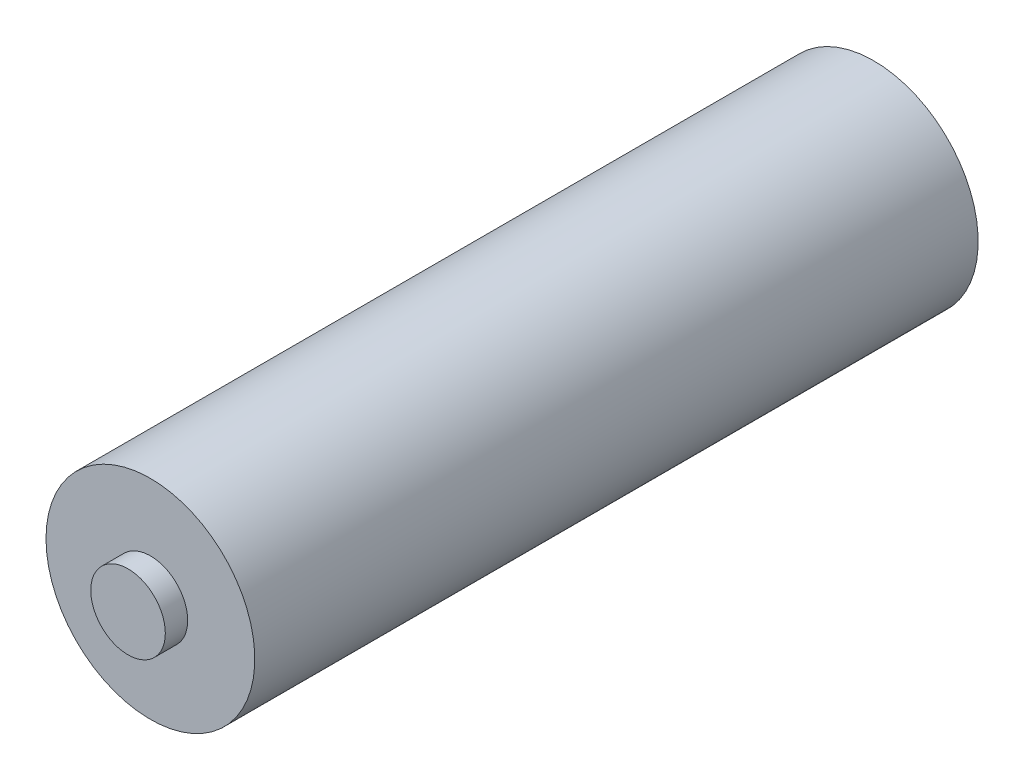
ISO-10303-21;
HEADER;
FILE_DESCRIPTION(('STEP AP214'),'2;1');
FILE_NAME('part.step','',(''),(''),'','','');
FILE_SCHEMA(('AUTOMOTIVE_DESIGN { 1 0 10303 214 1 1 1 1 }'));
ENDSEC;
DATA;
#1=APPLICATION_CONTEXT('core data for automotive mechanical design processes');
#2=APPLICATION_PROTOCOL_DEFINITION('international standard','automotive_design',2000,#1);
#3=PRODUCT_CONTEXT('',#1,'mechanical');
#4=PRODUCT('Part','Part','',(#3));
#5=PRODUCT_RELATED_PRODUCT_CATEGORY('part','',(#4));
#6=PRODUCT_DEFINITION_FORMATION('','',#4);
#7=PRODUCT_DEFINITION_CONTEXT('part definition',#1,'design');
#8=PRODUCT_DEFINITION('design','',#6,#7);
#9=PRODUCT_DEFINITION_SHAPE('','',#8);
#10=(LENGTH_UNIT() NAMED_UNIT(*) SI_UNIT(.MILLI.,.METRE.));
#11=(NAMED_UNIT(*) PLANE_ANGLE_UNIT() SI_UNIT($,.RADIAN.));
#12=(NAMED_UNIT(*) SI_UNIT($,.STERADIAN.) SOLID_ANGLE_UNIT());
#13=UNCERTAINTY_MEASURE_WITH_UNIT(LENGTH_MEASURE(1.E-05),#10,'distance_accuracy_value','');
#14=(GEOMETRIC_REPRESENTATION_CONTEXT(3) GLOBAL_UNCERTAINTY_ASSIGNED_CONTEXT((#13)) GLOBAL_UNIT_ASSIGNED_CONTEXT((#10,
#11,#12)) REPRESENTATION_CONTEXT('',''));
#15=CARTESIAN_POINT('',(0.,0.,0.));
#16=DIRECTION('',(0.,0.,1.));
#17=DIRECTION('',(1.,0.,0.));
#18=AXIS2_PLACEMENT_3D('',#15,#16,#17);
#19=CARTESIAN_POINT('',(0.,0.,48.5));
#20=DIRECTION('',(0.,0.,-1.));
#21=DIRECTION('',(-1.,0.,0.));
#22=AXIS2_PLACEMENT_3D('',#19,#20,#21);
#23=CYLINDRICAL_SURFACE('',#22,7.);
#24=CARTESIAN_POINT('',(0.,0.,48.5));
#25=DIRECTION('',(0.,0.,1.));
#26=DIRECTION('',(1.,0.,0.));
#27=AXIS2_PLACEMENT_3D('',#24,#25,#26);
#28=CIRCLE('',#27,7.);
#29=CARTESIAN_POINT('',(-7.,0.,48.5));
#30=VERTEX_POINT('',#29);
#31=EDGE_CURVE('E45',#30,#30,#28,.T.);
#32=CARTESIAN_POINT('',(0.,0.,0.));
#33=DIRECTION('',(0.,0.,1.));
#34=DIRECTION('',(1.,0.,0.));
#35=AXIS2_PLACEMENT_3D('',#32,#33,#34);
#36=CIRCLE('',#35,7.);
#37=CARTESIAN_POINT('',(-7.,0.,0.));
#38=VERTEX_POINT('',#37);
#39=EDGE_CURVE('E40',#38,#38,#36,.T.);
#40=CARTESIAN_POINT('',(-7.,0.,48.5));
#41=CARTESIAN_POINT('',(-7.,0.,47.9947916666667));
#42=CARTESIAN_POINT('',(-7.,0.,47.4895833333333));
#43=CARTESIAN_POINT('',(-7.,0.,46.4791666666667));
#44=CARTESIAN_POINT('',(-7.,0.,45.9739583333333));
#45=CARTESIAN_POINT('',(-7.,0.,44.9635416666667));
#46=CARTESIAN_POINT('',(-7.,0.,44.4583333333333));
#47=CARTESIAN_POINT('',(-7.,0.,43.4479166666667));
#48=CARTESIAN_POINT('',(-7.,0.,42.9427083333333));
#49=CARTESIAN_POINT('',(-7.,0.,41.9322916666667));
#50=CARTESIAN_POINT('',(-7.,0.,41.4270833333333));
#51=CARTESIAN_POINT('',(-7.,0.,40.4166666666667));
#52=CARTESIAN_POINT('',(-7.,0.,39.9114583333333));
#53=CARTESIAN_POINT('',(-7.,0.,38.9010416666667));
#54=CARTESIAN_POINT('',(-7.,0.,38.3958333333333));
#55=CARTESIAN_POINT('',(-7.,0.,37.3854166666667));
#56=CARTESIAN_POINT('',(-7.,0.,36.8802083333333));
#57=CARTESIAN_POINT('',(-7.,0.,35.8697916666667));
#58=CARTESIAN_POINT('',(-7.,0.,35.3645833333333));
#59=CARTESIAN_POINT('',(-7.,0.,34.3541666666667));
#60=CARTESIAN_POINT('',(-7.,0.,33.8489583333333));
#61=CARTESIAN_POINT('',(-7.,0.,32.8385416666667));
#62=CARTESIAN_POINT('',(-7.,0.,32.3333333333333));
#63=CARTESIAN_POINT('',(-7.,0.,31.3229166666667));
#64=CARTESIAN_POINT('',(-7.,0.,30.8177083333333));
#65=CARTESIAN_POINT('',(-7.,0.,29.8072916666667));
#66=CARTESIAN_POINT('',(-7.,0.,29.3020833333333));
#67=CARTESIAN_POINT('',(-7.,0.,28.2916666666667));
#68=CARTESIAN_POINT('',(-7.,0.,27.7864583333333));
#69=CARTESIAN_POINT('',(-7.,0.,26.7760416666667));
#70=CARTESIAN_POINT('',(-7.,0.,26.2708333333333));
#71=CARTESIAN_POINT('',(-7.,0.,25.2604166666667));
#72=CARTESIAN_POINT('',(-7.,0.,24.7552083333333));
#73=CARTESIAN_POINT('',(-7.,0.,23.7447916666667));
#74=CARTESIAN_POINT('',(-7.,0.,23.2395833333333));
#75=CARTESIAN_POINT('',(-7.,0.,22.2291666666667));
#76=CARTESIAN_POINT('',(-7.,0.,21.7239583333333));
#77=CARTESIAN_POINT('',(-7.,0.,20.7135416666667));
#78=CARTESIAN_POINT('',(-7.,0.,20.2083333333333));
#79=CARTESIAN_POINT('',(-7.,0.,19.1979166666667));
#80=CARTESIAN_POINT('',(-7.,0.,18.6927083333333));
#81=CARTESIAN_POINT('',(-7.,0.,17.6822916666667));
#82=CARTESIAN_POINT('',(-7.,0.,17.1770833333333));
#83=CARTESIAN_POINT('',(-7.,0.,16.1666666666667));
#84=CARTESIAN_POINT('',(-7.,0.,15.6614583333333));
#85=CARTESIAN_POINT('',(-7.,0.,14.6510416666667));
#86=CARTESIAN_POINT('',(-7.,0.,14.1458333333333));
#87=CARTESIAN_POINT('',(-7.,0.,13.1354166666667));
#88=CARTESIAN_POINT('',(-7.,0.,12.6302083333333));
#89=CARTESIAN_POINT('',(-7.,0.,11.6197916666667));
#90=CARTESIAN_POINT('',(-7.,0.,11.1145833333333));
#91=CARTESIAN_POINT('',(-7.,0.,10.1041666666667));
#92=CARTESIAN_POINT('',(-7.,0.,9.59895833333333));
#93=CARTESIAN_POINT('',(-7.,0.,8.58854166666666));
#94=CARTESIAN_POINT('',(-7.,0.,8.08333333333333));
#95=CARTESIAN_POINT('',(-7.,0.,7.07291666666666));
#96=CARTESIAN_POINT('',(-7.,0.,6.56770833333333));
#97=CARTESIAN_POINT('',(-7.,0.,5.55729166666666));
#98=CARTESIAN_POINT('',(-7.,0.,5.05208333333333));
#99=CARTESIAN_POINT('',(-7.,0.,4.04166666666666));
#100=CARTESIAN_POINT('',(-7.,0.,3.53645833333333));
#101=CARTESIAN_POINT('',(-7.,0.,2.52604166666666));
#102=CARTESIAN_POINT('',(-7.,0.,2.02083333333333));
#103=CARTESIAN_POINT('',(-7.,0.,1.01041666666666));
#104=CARTESIAN_POINT('',(-7.,0.,0.505208333333326));
#105=CARTESIAN_POINT('',(-7.,0.,0.));
#106=B_SPLINE_CURVE_WITH_KNOTS('',3,(#40,#41,#42,#43,#44,#45,#46,#47,#48,#49,#50,#51,#52,#53,
#54,#55,#56,#57,#58,#59,#60,#61,#62,#63,#64,#65,#66,#67,#68,#69,#70,#71,#72,#73,#74,#75,#76,#77,
#78,#79,#80,#81,#82,#83,#84,#85,#86,#87,#88,#89,#90,#91,#92,#93,#94,#95,#96,#97,#98,#99,#100,
#101,#102,#103,#104,#105),.UNSPECIFIED.,.F.,.F.,(4,2,2,2,2,2,2,2,2,2,2,2,2,2,2,2,2,2,2,2,2,2,2,
2,2,2,2,2,2,2,2,2,4),(0.,1.51562500000001,3.03125000000001,4.54687500000001,6.06250000000001,
7.57812500000001,9.09375000000001,10.609375,12.125,13.640625,15.15625,16.671875,18.1875,
19.703125,21.21875,22.734375,24.25,25.765625,27.28125,28.796875,30.3125,31.828125,33.34375,
34.859375,36.375,37.890625,39.40625,40.921875,42.4375,43.953125,45.46875,46.984375,48.5),.UNSPECIFIED.);
#107=EDGE_CURVE('BSEAM37',#30,#38,#106,.T.);
#108=ORIENTED_EDGE('',*,*,#31,.F.);
#109=ORIENTED_EDGE('',*,*,#39,.T.);
#110=ORIENTED_EDGE('',*,*,#107,.T.);
#111=ORIENTED_EDGE('',*,*,#107,.F.);
#112=EDGE_LOOP('',(#108,#110,#109,#111));
#113=FACE_BOUND('',#112,.T.);
#114=ADVANCED_FACE('F37',(#113),#23,.T.);
#115=CARTESIAN_POINT('',(0.,0.,48.5));
#116=DIRECTION('',(0.,0.,1.));
#117=DIRECTION('',(1.,0.,0.));
#118=AXIS2_PLACEMENT_3D('',#115,#116,#117);
#119=PLANE('',#118);
#120=CARTESIAN_POINT('',(0.,0.,48.5));
#121=DIRECTION('',(0.,0.,1.));
#122=DIRECTION('',(1.,0.,0.));
#123=AXIS2_PLACEMENT_3D('',#120,#121,#122);
#124=CIRCLE('',#123,2.5);
#125=CARTESIAN_POINT('',(2.5,0.,48.5));
#126=VERTEX_POINT('',#125);
#127=EDGE_CURVE('E10',#126,#126,#124,.T.);
#128=ORIENTED_EDGE('',*,*,#127,.F.);
#129=EDGE_LOOP('',(#128));
#130=FACE_BOUND('',#129,.T.);
#131=ORIENTED_EDGE('',*,*,#31,.T.);
#132=EDGE_LOOP('',(#131));
#133=FACE_BOUND('',#132,.T.);
#134=ADVANCED_FACE('F65',(#130,#133),#119,.T.);
#135=CARTESIAN_POINT('',(0.,0.,0.));
#136=DIRECTION('',(0.,0.,1.));
#137=DIRECTION('',(1.,0.,0.));
#138=AXIS2_PLACEMENT_3D('',#135,#136,#137);
#139=PLANE('',#138);
#140=ORIENTED_EDGE('',*,*,#39,.F.);
#141=EDGE_LOOP('',(#140));
#142=FACE_BOUND('',#141,.T.);
#143=ADVANCED_FACE('F62',(#142),#139,.F.);
#144=CARTESIAN_POINT('',(0.,0.,50.));
#145=DIRECTION('',(0.,0.,-1.));
#146=DIRECTION('',(-1.,0.,0.));
#147=AXIS2_PLACEMENT_3D('',#144,#145,#146);
#148=CYLINDRICAL_SURFACE('',#147,2.5);
#149=CARTESIAN_POINT('',(0.,0.,50.));
#150=DIRECTION('',(0.,0.,1.));
#151=DIRECTION('',(1.,0.,0.));
#152=AXIS2_PLACEMENT_3D('',#149,#150,#151);
#153=CIRCLE('',#152,2.5);
#154=CARTESIAN_POINT('',(2.5,0.,50.));
#155=VERTEX_POINT('',#154);
#156=EDGE_CURVE('E52',#155,#155,#153,.T.);
#157=ORIENTED_EDGE('',*,*,#156,.F.);
#158=EDGE_LOOP('',(#157));
#159=FACE_BOUND('',#158,.T.);
#160=ORIENTED_EDGE('',*,*,#127,.T.);
#161=EDGE_LOOP('',(#160));
#162=FACE_BOUND('',#161,.T.);
#163=ADVANCED_FACE('F64',(#159,#162),#148,.T.);
#164=CARTESIAN_POINT('',(0.,0.,50.));
#165=DIRECTION('',(0.,0.,1.));
#166=DIRECTION('',(1.,0.,0.));
#167=AXIS2_PLACEMENT_3D('',#164,#165,#166);
#168=PLANE('',#167);
#169=ORIENTED_EDGE('',*,*,#156,.T.);
#170=EDGE_LOOP('',(#169));
#171=FACE_BOUND('',#170,.T.);
#172=ADVANCED_FACE('F70',(#171),#168,.T.);
#173=CLOSED_SHELL('',(#114,#134,#143,#163,#172));
#174=MANIFOLD_SOLID_BREP('B2',#173);
#175=ADVANCED_BREP_SHAPE_REPRESENTATION('',(#18,#174),#14);
#176=SHAPE_DEFINITION_REPRESENTATION(#9,#175);
ENDSEC;
END-ISO-10303-21;
